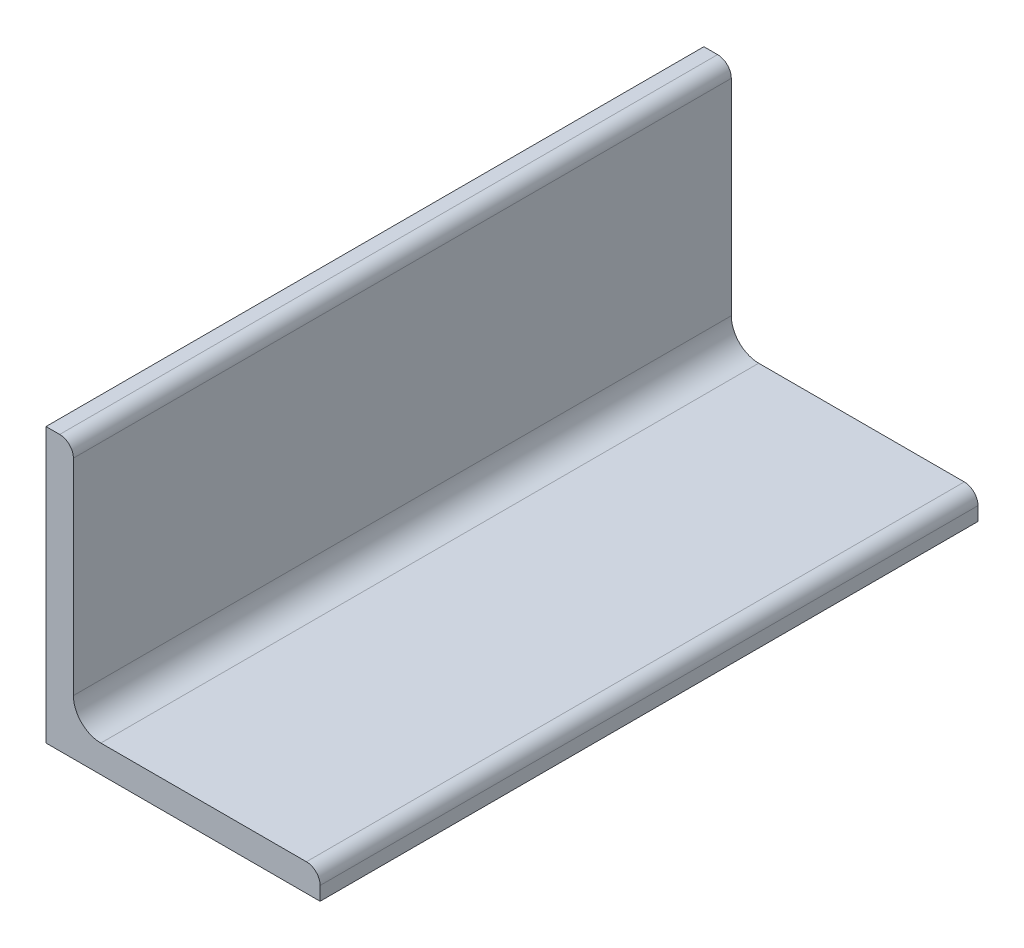
ISO-10303-21;
HEADER;
FILE_DESCRIPTION(('STEP AP214'),'2;1');
FILE_NAME('part.step','',(''),(''),'','','');
FILE_SCHEMA(('AUTOMOTIVE_DESIGN { 1 0 10303 214 1 1 1 1 }'));
ENDSEC;
DATA;
#1=APPLICATION_CONTEXT('core data for automotive mechanical design processes');
#2=APPLICATION_PROTOCOL_DEFINITION('international standard','automotive_design',2000,#1);
#3=PRODUCT_CONTEXT('',#1,'mechanical');
#4=PRODUCT('Part','Part','',(#3));
#5=PRODUCT_RELATED_PRODUCT_CATEGORY('part','',(#4));
#6=PRODUCT_DEFINITION_FORMATION('','',#4);
#7=PRODUCT_DEFINITION_CONTEXT('part definition',#1,'design');
#8=PRODUCT_DEFINITION('design','',#6,#7);
#9=PRODUCT_DEFINITION_SHAPE('','',#8);
#10=(LENGTH_UNIT() NAMED_UNIT(*) SI_UNIT(.MILLI.,.METRE.));
#11=(NAMED_UNIT(*) PLANE_ANGLE_UNIT() SI_UNIT($,.RADIAN.));
#12=(NAMED_UNIT(*) SI_UNIT($,.STERADIAN.) SOLID_ANGLE_UNIT());
#13=UNCERTAINTY_MEASURE_WITH_UNIT(LENGTH_MEASURE(1.E-05),#10,'distance_accuracy_value','');
#14=(GEOMETRIC_REPRESENTATION_CONTEXT(3) GLOBAL_UNCERTAINTY_ASSIGNED_CONTEXT((#13)) GLOBAL_UNIT_ASSIGNED_CONTEXT((#10,
#11,#12)) REPRESENTATION_CONTEXT('',''));
#15=CARTESIAN_POINT('',(0.,0.,0.));
#16=DIRECTION('',(0.,0.,1.));
#17=DIRECTION('',(1.,0.,0.));
#18=AXIS2_PLACEMENT_3D('',#15,#16,#17);
#19=CARTESIAN_POINT('',(0.0507450451214936,127.041655270204,304.8));
#20=DIRECTION('',(1.,0.,0.));
#21=DIRECTION('',(0.,0.,-1.));
#22=AXIS2_PLACEMENT_3D('',#19,#20,#21);
#23=PLANE('',#22);
#24=DIRECTION('',(0.,-1.,0.));
#25=VECTOR('',#24,1.);
#26=CARTESIAN_POINT('',(0.0507450451214936,127.041655270204,0.));
#27=LINE('',#26,#25);
#28=CARTESIAN_POINT('',(0.0507450451214936,127.041655270204,0.));
#29=VERTEX_POINT('',#28);
#30=CARTESIAN_POINT('',(0.0507450451214936,0.0416552702040917,0.));
#31=VERTEX_POINT('',#30);
#32=EDGE_CURVE('E135',#29,#31,#27,.T.);
#33=ORIENTED_EDGE('',*,*,#32,.T.);
#34=DIRECTION('',(0.,0.,-1.));
#35=VECTOR('',#34,1.);
#36=CARTESIAN_POINT('',(0.0507450451214936,0.0416552702040917,304.8));
#37=LINE('',#36,#35);
#38=CARTESIAN_POINT('',(0.0507450451214936,0.0416552702040917,304.8));
#39=VERTEX_POINT('',#38);
#40=EDGE_CURVE('E11',#39,#31,#37,.T.);
#41=ORIENTED_EDGE('',*,*,#40,.F.);
#42=DIRECTION('',(0.,-1.,0.));
#43=VECTOR('',#42,1.);
#44=CARTESIAN_POINT('',(0.0507450451214936,127.041655270204,304.8));
#45=LINE('',#44,#43);
#46=CARTESIAN_POINT('',(0.0507450451214936,127.041655270204,304.8));
#47=VERTEX_POINT('',#46);
#48=EDGE_CURVE('E151',#47,#39,#45,.T.);
#49=ORIENTED_EDGE('',*,*,#48,.F.);
#50=DIRECTION('',(0.,0.,-1.));
#51=VECTOR('',#50,1.);
#52=CARTESIAN_POINT('',(0.0507450451214936,127.041655270204,304.8));
#53=LINE('',#52,#51);
#54=EDGE_CURVE('E131',#47,#29,#53,.T.);
#55=ORIENTED_EDGE('',*,*,#54,.T.);
#56=EDGE_LOOP('',(#33,#41,#49,#55));
#57=FACE_BOUND('',#56,.T.);
#58=ADVANCED_FACE('F33',(#57),#23,.F.);
#59=CARTESIAN_POINT('',(0.0507450451214936,0.0416552702040917,304.8));
#60=DIRECTION('',(0.,1.,0.));
#61=DIRECTION('',(0.,0.,1.));
#62=AXIS2_PLACEMENT_3D('',#59,#60,#61);
#63=PLANE('',#62);
#64=DIRECTION('',(1.,0.,0.));
#65=VECTOR('',#64,1.);
#66=CARTESIAN_POINT('',(0.0507450451214936,0.0416552702040917,0.));
#67=LINE('',#66,#65);
#68=CARTESIAN_POINT('',(127.050745045121,0.0416552702040917,0.));
#69=VERTEX_POINT('',#68);
#70=EDGE_CURVE('E138',#31,#69,#67,.T.);
#71=ORIENTED_EDGE('',*,*,#70,.T.);
#72=DIRECTION('',(0.,0.,-1.));
#73=VECTOR('',#72,1.);
#74=CARTESIAN_POINT('',(127.050745045121,0.0416552702040917,304.8));
#75=LINE('',#74,#73);
#76=CARTESIAN_POINT('',(127.050745045121,0.0416552702040917,304.8));
#77=VERTEX_POINT('',#76);
#78=EDGE_CURVE('E41',#77,#69,#75,.T.);
#79=ORIENTED_EDGE('',*,*,#78,.F.);
#80=DIRECTION('',(1.,0.,0.));
#81=VECTOR('',#80,1.);
#82=CARTESIAN_POINT('',(0.0507450451214936,0.0416552702040917,304.8));
#83=LINE('',#82,#81);
#84=EDGE_CURVE('E95',#39,#77,#83,.T.);
#85=ORIENTED_EDGE('',*,*,#84,.F.);
#86=ORIENTED_EDGE('',*,*,#40,.T.);
#87=EDGE_LOOP('',(#71,#79,#85,#86));
#88=FACE_BOUND('',#87,.T.);
#89=ADVANCED_FACE('F194',(#88),#63,.F.);
#90=CARTESIAN_POINT('',(127.050745045121,0.0416552702040917,304.8));
#91=DIRECTION('',(-1.,0.,0.));
#92=DIRECTION('',(0.,0.,1.));
#93=AXIS2_PLACEMENT_3D('',#90,#91,#92);
#94=PLANE('',#93);
#95=DIRECTION('',(0.,1.,0.));
#96=VECTOR('',#95,1.);
#97=CARTESIAN_POINT('',(127.050745045121,0.0416552702040917,0.));
#98=LINE('',#97,#96);
#99=CARTESIAN_POINT('',(127.050745045121,6.39165527020409,0.));
#100=VERTEX_POINT('',#99);
#101=EDGE_CURVE('E140',#69,#100,#98,.T.);
#102=ORIENTED_EDGE('',*,*,#101,.T.);
#103=DIRECTION('',(0.,0.,-1.));
#104=VECTOR('',#103,1.);
#105=CARTESIAN_POINT('',(127.050745045121,6.39165527020409,304.8));
#106=LINE('',#105,#104);
#107=CARTESIAN_POINT('',(127.050745045121,6.39165527020409,304.8));
#108=VERTEX_POINT('',#107);
#109=EDGE_CURVE('E161',#108,#100,#106,.T.);
#110=ORIENTED_EDGE('',*,*,#109,.F.);
#111=DIRECTION('',(0.,1.,0.));
#112=VECTOR('',#111,1.);
#113=CARTESIAN_POINT('',(127.050745045121,0.0416552702040917,304.8));
#114=LINE('',#113,#112);
#115=EDGE_CURVE('E169',#77,#108,#114,.T.);
#116=ORIENTED_EDGE('',*,*,#115,.F.);
#117=ORIENTED_EDGE('',*,*,#78,.T.);
#118=EDGE_LOOP('',(#102,#110,#116,#117));
#119=FACE_BOUND('',#118,.T.);
#120=ADVANCED_FACE('F167',(#119),#94,.F.);
#121=CARTESIAN_POINT('',(120.700745045121,6.39165527020409,304.8));
#122=DIRECTION('',(0.,0.,-1.));
#123=DIRECTION('',(-1.,0.,0.));
#124=AXIS2_PLACEMENT_3D('',#121,#122,#123);
#125=CYLINDRICAL_SURFACE('',#124,6.35);
#126=CARTESIAN_POINT('',(120.700745045121,6.39165527020409,0.));
#127=DIRECTION('',(0.,0.,1.));
#128=DIRECTION('',(1.,0.,0.));
#129=AXIS2_PLACEMENT_3D('',#126,#127,#128);
#130=CIRCLE('',#129,6.35);
#131=CARTESIAN_POINT('',(120.700745045121,12.7416552702041,0.));
#132=VERTEX_POINT('',#131);
#133=EDGE_CURVE('E142',#100,#132,#130,.T.);
#134=ORIENTED_EDGE('',*,*,#133,.T.);
#135=DIRECTION('',(0.,0.,-1.));
#136=VECTOR('',#135,1.);
#137=CARTESIAN_POINT('',(120.700745045121,12.7416552702041,304.8));
#138=LINE('',#137,#136);
#139=CARTESIAN_POINT('',(120.700745045121,12.7416552702041,304.8));
#140=VERTEX_POINT('',#139);
#141=EDGE_CURVE('E158',#140,#132,#138,.T.);
#142=ORIENTED_EDGE('',*,*,#141,.F.);
#143=CARTESIAN_POINT('',(120.700745045121,6.39165527020409,304.8));
#144=DIRECTION('',(0.,0.,1.));
#145=DIRECTION('',(1.,0.,0.));
#146=AXIS2_PLACEMENT_3D('',#143,#144,#145);
#147=CIRCLE('',#146,6.35);
#148=EDGE_CURVE('E185',#108,#140,#147,.T.);
#149=ORIENTED_EDGE('',*,*,#148,.F.);
#150=ORIENTED_EDGE('',*,*,#109,.T.);
#151=EDGE_LOOP('',(#134,#142,#149,#150));
#152=FACE_BOUND('',#151,.T.);
#153=ADVANCED_FACE('F178',(#152),#125,.T.);
#154=CARTESIAN_POINT('',(120.700745045121,12.7416552702041,304.8));
#155=DIRECTION('',(0.,-1.,0.));
#156=DIRECTION('',(0.,0.,-1.));
#157=AXIS2_PLACEMENT_3D('',#154,#155,#156);
#158=PLANE('',#157);
#159=DIRECTION('',(-1.,0.,0.));
#160=VECTOR('',#159,1.);
#161=CARTESIAN_POINT('',(120.700745045121,12.7416552702041,0.));
#162=LINE('',#161,#160);
#163=CARTESIAN_POINT('',(25.4507450451215,12.7416552702041,0.));
#164=VERTEX_POINT('',#163);
#165=EDGE_CURVE('E144',#132,#164,#162,.T.);
#166=ORIENTED_EDGE('',*,*,#165,.T.);
#167=DIRECTION('',(0.,0.,-1.));
#168=VECTOR('',#167,1.);
#169=CARTESIAN_POINT('',(25.4507450451215,12.7416552702041,304.8));
#170=LINE('',#169,#168);
#171=CARTESIAN_POINT('',(25.4507450451215,12.7416552702041,304.8));
#172=VERTEX_POINT('',#171);
#173=EDGE_CURVE('E155',#172,#164,#170,.T.);
#174=ORIENTED_EDGE('',*,*,#173,.F.);
#175=DIRECTION('',(-1.,0.,0.));
#176=VECTOR('',#175,1.);
#177=CARTESIAN_POINT('',(120.700745045121,12.7416552702041,304.8));
#178=LINE('',#177,#176);
#179=EDGE_CURVE('E184',#140,#172,#178,.T.);
#180=ORIENTED_EDGE('',*,*,#179,.F.);
#181=ORIENTED_EDGE('',*,*,#141,.T.);
#182=EDGE_LOOP('',(#166,#174,#180,#181));
#183=FACE_BOUND('',#182,.T.);
#184=ADVANCED_FACE('F182',(#183),#158,.F.);
#185=CARTESIAN_POINT('',(25.4507450451215,25.4416552702041,304.8));
#186=DIRECTION('',(0.,0.,-1.));
#187=DIRECTION('',(-1.,0.,0.));
#188=AXIS2_PLACEMENT_3D('',#185,#186,#187);
#189=CYLINDRICAL_SURFACE('',#188,12.7);
#190=CARTESIAN_POINT('',(25.4507450451215,25.4416552702041,0.));
#191=DIRECTION('',(0.,0.,-1.));
#192=DIRECTION('',(1.,0.,0.));
#193=AXIS2_PLACEMENT_3D('',#190,#191,#192);
#194=CIRCLE('',#193,12.7);
#195=CARTESIAN_POINT('',(12.7507450451215,25.4416552702041,0.));
#196=VERTEX_POINT('',#195);
#197=EDGE_CURVE('E146',#164,#196,#194,.T.);
#198=ORIENTED_EDGE('',*,*,#197,.T.);
#199=DIRECTION('',(0.,0.,-1.));
#200=VECTOR('',#199,1.);
#201=CARTESIAN_POINT('',(12.7507450451215,25.4416552702041,304.8));
#202=LINE('',#201,#200);
#203=CARTESIAN_POINT('',(12.7507450451215,25.4416552702041,304.8));
#204=VERTEX_POINT('',#203);
#205=EDGE_CURVE('E126',#204,#196,#202,.T.);
#206=ORIENTED_EDGE('',*,*,#205,.F.);
#207=CARTESIAN_POINT('',(25.4507450451215,25.4416552702041,304.8));
#208=DIRECTION('',(0.,0.,-1.));
#209=DIRECTION('',(1.,0.,0.));
#210=AXIS2_PLACEMENT_3D('',#207,#208,#209);
#211=CIRCLE('',#210,12.7);
#212=EDGE_CURVE('E117',#172,#204,#211,.T.);
#213=ORIENTED_EDGE('',*,*,#212,.F.);
#214=ORIENTED_EDGE('',*,*,#173,.T.);
#215=EDGE_LOOP('',(#198,#206,#213,#214));
#216=FACE_BOUND('',#215,.T.);
#217=ADVANCED_FACE('F206',(#216),#189,.F.);
#218=CARTESIAN_POINT('',(12.7507450451215,25.4416552702041,304.8));
#219=DIRECTION('',(-1.,0.,0.));
#220=DIRECTION('',(0.,0.,1.));
#221=AXIS2_PLACEMENT_3D('',#218,#219,#220);
#222=PLANE('',#221);
#223=DIRECTION('',(0.,1.,0.));
#224=VECTOR('',#223,1.);
#225=CARTESIAN_POINT('',(12.7507450451215,25.4416552702041,0.));
#226=LINE('',#225,#224);
#227=CARTESIAN_POINT('',(12.7507450451215,120.691655270204,0.));
#228=VERTEX_POINT('',#227);
#229=EDGE_CURVE('E125',#196,#228,#226,.T.);
#230=ORIENTED_EDGE('',*,*,#229,.T.);
#231=DIRECTION('',(0.,0.,-1.));
#232=VECTOR('',#231,1.);
#233=CARTESIAN_POINT('',(12.7507450451215,120.691655270204,304.8));
#234=LINE('',#233,#232);
#235=CARTESIAN_POINT('',(12.7507450451215,120.691655270204,304.8));
#236=VERTEX_POINT('',#235);
#237=EDGE_CURVE('E122',#236,#228,#234,.T.);
#238=ORIENTED_EDGE('',*,*,#237,.F.);
#239=DIRECTION('',(0.,1.,0.));
#240=VECTOR('',#239,1.);
#241=CARTESIAN_POINT('',(12.7507450451215,25.4416552702041,304.8));
#242=LINE('',#241,#240);
#243=EDGE_CURVE('E111',#204,#236,#242,.T.);
#244=ORIENTED_EDGE('',*,*,#243,.F.);
#245=ORIENTED_EDGE('',*,*,#205,.T.);
#246=EDGE_LOOP('',(#230,#238,#244,#245));
#247=FACE_BOUND('',#246,.T.);
#248=ADVANCED_FACE('F123',(#247),#222,.F.);
#249=CARTESIAN_POINT('',(6.4007450451215,120.691655270204,304.8));
#250=DIRECTION('',(0.,0.,-1.));
#251=DIRECTION('',(-1.,0.,0.));
#252=AXIS2_PLACEMENT_3D('',#249,#250,#251);
#253=CYLINDRICAL_SURFACE('',#252,6.35);
#254=CARTESIAN_POINT('',(6.4007450451215,120.691655270204,0.));
#255=DIRECTION('',(0.,0.,1.));
#256=DIRECTION('',(1.,0.,0.));
#257=AXIS2_PLACEMENT_3D('',#254,#255,#256);
#258=CIRCLE('',#257,6.35);
#259=CARTESIAN_POINT('',(6.40074504512149,127.041655270204,0.));
#260=VERTEX_POINT('',#259);
#261=EDGE_CURVE('E81',#228,#260,#258,.T.);
#262=ORIENTED_EDGE('',*,*,#261,.T.);
#263=DIRECTION('',(0.,0.,-1.));
#264=VECTOR('',#263,1.);
#265=CARTESIAN_POINT('',(6.40074504512149,127.041655270204,304.8));
#266=LINE('',#265,#264);
#267=CARTESIAN_POINT('',(6.40074504512149,127.041655270204,304.8));
#268=VERTEX_POINT('',#267);
#269=EDGE_CURVE('E127',#268,#260,#266,.T.);
#270=ORIENTED_EDGE('',*,*,#269,.F.);
#271=CARTESIAN_POINT('',(6.4007450451215,120.691655270204,304.8));
#272=DIRECTION('',(0.,0.,1.));
#273=DIRECTION('',(1.,0.,0.));
#274=AXIS2_PLACEMENT_3D('',#271,#272,#273);
#275=CIRCLE('',#274,6.35);
#276=EDGE_CURVE('E115',#236,#268,#275,.T.);
#277=ORIENTED_EDGE('',*,*,#276,.F.);
#278=ORIENTED_EDGE('',*,*,#237,.T.);
#279=EDGE_LOOP('',(#262,#270,#277,#278));
#280=FACE_BOUND('',#279,.T.);
#281=ADVANCED_FACE('F129',(#280),#253,.T.);
#282=CARTESIAN_POINT('',(6.40074504512149,127.041655270204,304.8));
#283=DIRECTION('',(0.,-1.,0.));
#284=DIRECTION('',(0.,0.,-1.));
#285=AXIS2_PLACEMENT_3D('',#282,#283,#284);
#286=PLANE('',#285);
#287=DIRECTION('',(-1.,0.,0.));
#288=VECTOR('',#287,1.);
#289=CARTESIAN_POINT('',(6.40074504512149,127.041655270204,0.));
#290=LINE('',#289,#288);
#291=EDGE_CURVE('E87',#260,#29,#290,.T.);
#292=ORIENTED_EDGE('',*,*,#291,.T.);
#293=ORIENTED_EDGE('',*,*,#54,.F.);
#294=DIRECTION('',(-1.,0.,0.));
#295=VECTOR('',#294,1.);
#296=CARTESIAN_POINT('',(6.40074504512149,127.041655270204,304.8));
#297=LINE('',#296,#295);
#298=EDGE_CURVE('E49',#268,#47,#297,.T.);
#299=ORIENTED_EDGE('',*,*,#298,.F.);
#300=ORIENTED_EDGE('',*,*,#269,.T.);
#301=EDGE_LOOP('',(#292,#293,#299,#300));
#302=FACE_BOUND('',#301,.T.);
#303=ADVANCED_FACE('F214',(#302),#286,.F.);
#304=CARTESIAN_POINT('',(120.700745045121,6.39165527020409,304.8));
#305=DIRECTION('',(0.,0.,1.));
#306=DIRECTION('',(1.,0.,0.));
#307=AXIS2_PLACEMENT_3D('',#304,#305,#306);
#308=PLANE('',#307);
#309=ORIENTED_EDGE('',*,*,#48,.T.);
#310=ORIENTED_EDGE('',*,*,#84,.T.);
#311=ORIENTED_EDGE('',*,*,#115,.T.);
#312=ORIENTED_EDGE('',*,*,#148,.T.);
#313=ORIENTED_EDGE('',*,*,#179,.T.);
#314=ORIENTED_EDGE('',*,*,#212,.T.);
#315=ORIENTED_EDGE('',*,*,#243,.T.);
#316=ORIENTED_EDGE('',*,*,#276,.T.);
#317=ORIENTED_EDGE('',*,*,#298,.T.);
#318=EDGE_LOOP('',(#309,#310,#311,#312,#313,#314,#315,#316,#317));
#319=FACE_BOUND('',#318,.T.);
#320=ADVANCED_FACE('F113',(#319),#308,.T.);
#321=CARTESIAN_POINT('',(120.700745045121,6.39165527020409,0.));
#322=DIRECTION('',(0.,0.,1.));
#323=DIRECTION('',(1.,0.,0.));
#324=AXIS2_PLACEMENT_3D('',#321,#322,#323);
#325=PLANE('',#324);
#326=ORIENTED_EDGE('',*,*,#32,.F.);
#327=ORIENTED_EDGE('',*,*,#291,.F.);
#328=ORIENTED_EDGE('',*,*,#261,.F.);
#329=ORIENTED_EDGE('',*,*,#229,.F.);
#330=ORIENTED_EDGE('',*,*,#197,.F.);
#331=ORIENTED_EDGE('',*,*,#165,.F.);
#332=ORIENTED_EDGE('',*,*,#133,.F.);
#333=ORIENTED_EDGE('',*,*,#101,.F.);
#334=ORIENTED_EDGE('',*,*,#70,.F.);
#335=EDGE_LOOP('',(#326,#327,#328,#329,#330,#331,#332,#333,#334));
#336=FACE_BOUND('',#335,.T.);
#337=ADVANCED_FACE('F173',(#336),#325,.F.);
#338=CLOSED_SHELL('',(#58,#89,#120,#153,#184,#217,#248,#281,#303,#320,#337));
#339=MANIFOLD_SOLID_BREP('B2',#338);
#340=ADVANCED_BREP_SHAPE_REPRESENTATION('',(#18,#339),#14);
#341=SHAPE_DEFINITION_REPRESENTATION(#9,#340);
ENDSEC;
END-ISO-10303-21;
